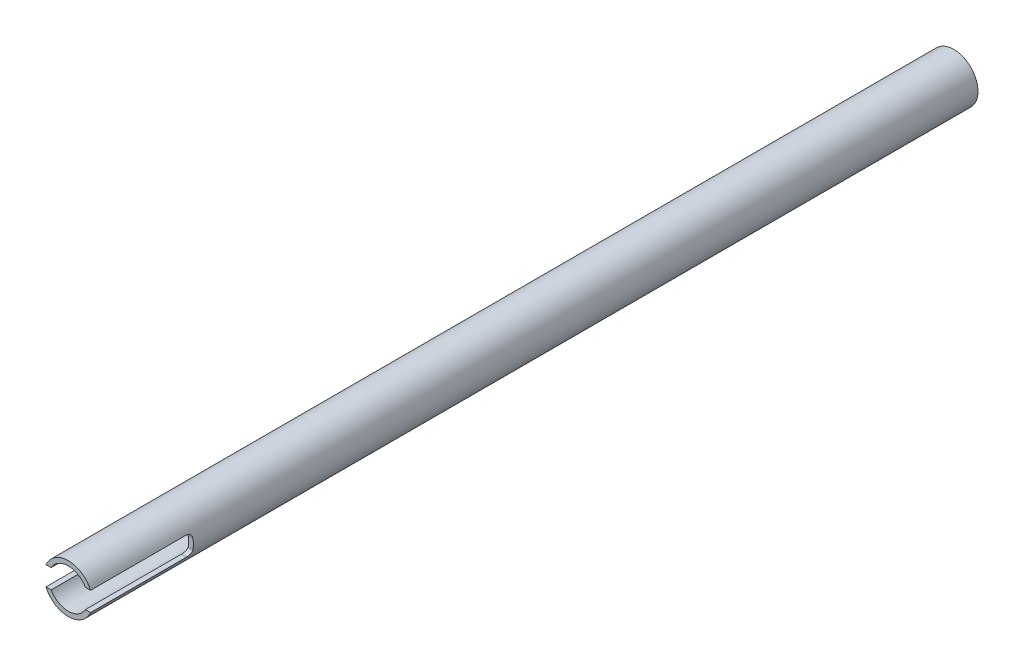
ISO-10303-21;
HEADER;
FILE_DESCRIPTION(('STEP AP214'),'2;1');
FILE_NAME('part.step','',(''),(''),'','','');
FILE_SCHEMA(('AUTOMOTIVE_DESIGN { 1 0 10303 214 1 1 1 1 }'));
ENDSEC;
DATA;
#1=APPLICATION_CONTEXT('core data for automotive mechanical design processes');
#2=APPLICATION_PROTOCOL_DEFINITION('international standard','automotive_design',2000,#1);
#3=PRODUCT_CONTEXT('',#1,'mechanical');
#4=PRODUCT('Part','Part','',(#3));
#5=PRODUCT_RELATED_PRODUCT_CATEGORY('part','',(#4));
#6=PRODUCT_DEFINITION_FORMATION('','',#4);
#7=PRODUCT_DEFINITION_CONTEXT('part definition',#1,'design');
#8=PRODUCT_DEFINITION('design','',#6,#7);
#9=PRODUCT_DEFINITION_SHAPE('','',#8);
#10=(LENGTH_UNIT() NAMED_UNIT(*) SI_UNIT(.MILLI.,.METRE.));
#11=(NAMED_UNIT(*) PLANE_ANGLE_UNIT() SI_UNIT($,.RADIAN.));
#12=(NAMED_UNIT(*) SI_UNIT($,.STERADIAN.) SOLID_ANGLE_UNIT());
#13=UNCERTAINTY_MEASURE_WITH_UNIT(LENGTH_MEASURE(1.E-05),#10,'distance_accuracy_value','');
#14=(GEOMETRIC_REPRESENTATION_CONTEXT(3) GLOBAL_UNCERTAINTY_ASSIGNED_CONTEXT((#13)) GLOBAL_UNIT_ASSIGNED_CONTEXT((#10,
#11,#12)) REPRESENTATION_CONTEXT('',''));
#15=CARTESIAN_POINT('',(0.,0.,0.));
#16=DIRECTION('',(0.,0.,1.));
#17=DIRECTION('',(1.,0.,0.));
#18=AXIS2_PLACEMENT_3D('',#15,#16,#17);
#19=CARTESIAN_POINT('',(0.,0.,0.));
#20=DIRECTION('',(0.,0.,-1.));
#21=DIRECTION('',(1.,0.,0.));
#22=AXIS2_PLACEMENT_3D('',#19,#20,#21);
#23=PLANE('',#22);
#24=DIRECTION('',(-1.,0.,0.));
#25=VECTOR('',#24,1.);
#26=CARTESIAN_POINT('',(376.220399741654,-3.17500000000001,0.));
#27=LINE('',#26,#25);
#28=CARTESIAN_POINT('',(7.34407080575888,-3.17500000000001,0.));
#29=VERTEX_POINT('',#28);
#30=CARTESIAN_POINT('',(5.64543213580679,-3.17499999999999,0.));
#31=VERTEX_POINT('',#30);
#32=EDGE_CURVE('E148',#29,#31,#27,.T.);
#33=ORIENTED_EDGE('',*,*,#32,.T.);
#34=CARTESIAN_POINT('',(0.,0.,0.));
#35=DIRECTION('',(0.,0.,1.));
#36=DIRECTION('',(1.,0.,0.));
#37=AXIS2_PLACEMENT_3D('',#34,#35,#36);
#38=CIRCLE('',#37,6.477);
#39=CARTESIAN_POINT('',(-5.64543213580682,-3.17500000000001,0.));
#40=VERTEX_POINT('',#39);
#41=EDGE_CURVE('E253',#40,#31,#38,.T.);
#42=ORIENTED_EDGE('',*,*,#41,.F.);
#43=CARTESIAN_POINT('',(-7.34407080575888,-3.17500000000001,0.));
#44=VERTEX_POINT('',#43);
#45=EDGE_CURVE('E143',#40,#44,#27,.T.);
#46=ORIENTED_EDGE('',*,*,#45,.T.);
#47=CARTESIAN_POINT('',(0.,0.,0.));
#48=DIRECTION('',(0.,0.,1.));
#49=DIRECTION('',(1.,0.,0.));
#50=AXIS2_PLACEMENT_3D('',#47,#48,#49);
#51=CIRCLE('',#50,8.001);
#52=EDGE_CURVE('E257',#44,#29,#51,.T.);
#53=ORIENTED_EDGE('',*,*,#52,.T.);
#54=EDGE_LOOP('',(#33,#42,#46,#53));
#55=FACE_BOUND('',#54,.T.);
#56=ADVANCED_FACE('F43',(#55),#23,.F.);
#57=CARTESIAN_POINT('',(0.,0.,-292.1));
#58=DIRECTION('',(0.,0.,1.));
#59=DIRECTION('',(-1.,0.,0.));
#60=AXIS2_PLACEMENT_3D('',#57,#58,#59);
#61=CYLINDRICAL_SURFACE('',#60,8.001);
#62=CARTESIAN_POINT('',(0.,0.,-292.1));
#63=DIRECTION('',(0.,0.,1.));
#64=DIRECTION('',(1.,0.,0.));
#65=AXIS2_PLACEMENT_3D('',#62,#63,#64);
#66=CIRCLE('',#65,8.001);
#67=CARTESIAN_POINT('',(8.001,0.,-292.1));
#68=VERTEX_POINT('',#67);
#69=EDGE_CURVE('E261',#68,#68,#66,.T.);
#70=ORIENTED_EDGE('',*,*,#69,.T.);
#71=EDGE_LOOP('',(#70));
#72=FACE_BOUND('',#71,.T.);
#73=DIRECTION('',(0.,0.,1.));
#74=VECTOR('',#73,1.);
#75=CARTESIAN_POINT('',(7.34407080575892,3.17499999999991,-292.1));
#76=LINE('',#75,#74);
#77=CARTESIAN_POINT('',(7.34407080575894,3.175,0.));
#78=VERTEX_POINT('',#77);
#79=CARTESIAN_POINT('',(7.34407080575889,3.17499999999999,-31.75));
#80=VERTEX_POINT('',#79);
#81=EDGE_CURVE('E248',#78,#80,#76,.F.);
#82=ORIENTED_EDGE('',*,*,#81,.T.);
#83=CARTESIAN_POINT('',(7.34407080575889,3.17499999999999,-31.75));
#84=CARTESIAN_POINT('',(7.34406800969131,3.17500157818637,-31.7906984476088));
#85=CARTESIAN_POINT('',(7.34477630214678,3.17336860893185,-31.8313759502433));
#86=CARTESIAN_POINT('',(7.34758309143993,3.16686635956911,-31.912411407968));
#87=CARTESIAN_POINT('',(7.34968118035478,3.16199802907894,-31.9527694533067));
#88=CARTESIAN_POINT('',(7.35798857580184,3.14264423927031,-32.0726338560667));
#89=CARTESIAN_POINT('',(7.36621159330719,3.12340930879255,-32.1512906881812));
#90=CARTESIAN_POINT('',(7.38735918413183,3.07305366060582,-32.3038993996992));
#91=CARTESIAN_POINT('',(7.40028060607282,3.04194090905527,-32.377854393813));
#92=CARTESIAN_POINT('',(7.42988157799941,2.96890708335136,-32.5194453435949));
#93=CARTESIAN_POINT('',(7.44656372650465,2.92697853298671,-32.5870768840646));
#94=CARTESIAN_POINT('',(7.48338951433549,2.83153727514406,-32.7173193992745));
#95=CARTESIAN_POINT('',(7.50365176960141,2.77760154335604,-32.7795861247467));
#96=CARTESIAN_POINT('',(7.54586923311685,2.66077336101832,-32.8943978381578));
#97=CARTESIAN_POINT('',(7.56782510086072,2.59787741319579,-32.9469390116058));
#98=CARTESIAN_POINT('',(7.61377353576087,2.4600953298757,-33.04442490565));
#99=CARTESIAN_POINT('',(7.6378032762924,2.38468542927394,-33.088613263246));
#100=CARTESIAN_POINT('',(7.68517828309944,2.22728162943211,-33.1635295949975));
#101=CARTESIAN_POINT('',(7.70852388215323,2.14529100625112,-33.1942642181981));
#102=CARTESIAN_POINT('',(7.74866065435345,1.99473307846586,-33.2363269168587));
#103=CARTESIAN_POINT('',(7.76579152458538,1.92700882203658,-33.2503889784846));
#104=CARTESIAN_POINT('',(7.79853598216448,1.78994063052701,-33.2692336722557));
#105=CARTESIAN_POINT('',(7.81414985826825,1.72059700681908,-33.2740180736839));
#106=CARTESIAN_POINT('',(7.8288057837706,1.65099999999999,-33.274));
#107=B_SPLINE_CURVE_WITH_KNOTS('',3,(#83,#84,#85,#86,#87,#88,#89,#90,#91,#92,#93,#94,#95,#96,
#97,#98,#99,#100,#101,#102,#103,#104,#105,#106),.UNSPECIFIED.,.F.,.F.,(4,2,2,2,2,2,2,2,2,2,2,4),
(0.,0.122015614312961,0.243995431359561,0.486888996424005,0.729619944201783,0.972519126749114,
1.22593711832599,1.47945429417213,1.75015649231414,2.02072475374975,2.23388433321155,
2.44700325838137),.UNSPECIFIED.);
#108=CARTESIAN_POINT('',(7.8288057837706,1.65099999999999,-33.274));
#109=VERTEX_POINT('',#108);
#110=EDGE_CURVE('E242',#80,#109,#107,.T.);
#111=ORIENTED_EDGE('',*,*,#110,.T.);
#112=CARTESIAN_POINT('',(0.,0.,-33.274));
#113=DIRECTION('',(0.,0.,-1.));
#114=DIRECTION('',(-1.,0.,0.));
#115=AXIS2_PLACEMENT_3D('',#112,#113,#114);
#116=CIRCLE('',#115,8.001);
#117=CARTESIAN_POINT('',(7.8288057837706,-1.65100000000001,-33.274));
#118=VERTEX_POINT('',#117);
#119=EDGE_CURVE('E158',#109,#118,#116,.T.);
#120=ORIENTED_EDGE('',*,*,#119,.T.);
#121=CARTESIAN_POINT('',(7.8288057837706,-1.65100000000001,-33.274));
#122=CARTESIAN_POINT('',(7.81947795268344,-1.69524181564516,-33.2739996807889));
#123=CARTESIAN_POINT('',(7.80977555287386,-1.73937906238705,-33.2720725755956));
#124=CARTESIAN_POINT('',(7.78970531909619,-1.82715995012295,-33.2644259194222));
#125=CARTESIAN_POINT('',(7.77933765259943,-1.87080371211602,-33.2587073195399));
#126=CARTESIAN_POINT('',(7.74740781787862,-2.00038689143381,-33.2359920832168));
#127=CARTESIAN_POINT('',(7.72497172734662,-2.08520038066886,-33.2134353611242));
#128=CARTESIAN_POINT('',(7.67879255624773,-2.24931803273245,-33.1543529357356));
#129=CARTESIAN_POINT('',(7.65505009243317,-2.3286247560322,-33.117833776622));
#130=CARTESIAN_POINT('',(7.60739952527334,-2.47987144136616,-33.0318403935313));
#131=CARTESIAN_POINT('',(7.58349136309819,-2.55180862700728,-32.9823613118312));
#132=CARTESIAN_POINT('',(7.5364011382251,-2.6877387711248,-32.8705553900397));
#133=CARTESIAN_POINT('',(7.51324222932275,-2.75155008701078,-32.8079974672164));
#134=CARTESIAN_POINT('',(7.46969556535497,-2.86766507697726,-32.6721080561482));
#135=CARTESIAN_POINT('',(7.44930787514765,-2.9199684817423,-32.5987763158346));
#136=CARTESIAN_POINT('',(7.41339882631974,-3.00995182097471,-32.445356056821));
#137=CARTESIAN_POINT('',(7.39775949227145,-3.04799299625045,-32.365507568052));
#138=CARTESIAN_POINT('',(7.37198636942665,-3.10981595853762,-32.1996963126839));
#139=CARTESIAN_POINT('',(7.36184321814923,-3.13362200161647,-32.1137442276388));
#140=CARTESIAN_POINT('',(7.35134082404797,-3.15814271182935,-31.980748149592));
#141=CARTESIAN_POINT('',(7.34862226710173,-3.16445643648464,-31.9348527548858));
#142=CARTESIAN_POINT('',(7.34498545577233,-3.17288497032067,-31.8426477775769));
#143=CARTESIAN_POINT('',(7.34406565426135,-3.17500338794751,-31.7963385853611));
#144=CARTESIAN_POINT('',(7.34407080575888,-3.175,-31.75));
#145=B_SPLINE_CURVE_WITH_KNOTS('',3,(#121,#122,#123,#124,#125,#126,#127,#128,#129,#130,#131,
#132,#133,#134,#135,#136,#137,#138,#139,#140,#141,#142,#143,#144),.UNSPECIFIED.,.F.,.F.,(4,2,2,
2,2,2,2,2,2,2,2,4),(0.,0.135553024626244,0.271072058592371,0.541437670457961,0.811676717226673,
1.082017202076,1.35761362878683,1.63321650449497,1.90127196271358,2.16886935439238,
2.3078905012207,2.4467920218655),.UNSPECIFIED.);
#146=CARTESIAN_POINT('',(7.34407080575888,-3.175,-31.75));
#147=VERTEX_POINT('',#146);
#148=EDGE_CURVE('E139',#118,#147,#145,.T.);
#149=ORIENTED_EDGE('',*,*,#148,.T.);
#150=DIRECTION('',(0.,0.,1.));
#151=VECTOR('',#150,1.);
#152=CARTESIAN_POINT('',(7.34407080575889,-3.17499999999999,-292.1));
#153=LINE('',#152,#151);
#154=EDGE_CURVE('E145',#147,#29,#153,.T.);
#155=ORIENTED_EDGE('',*,*,#154,.T.);
#156=ORIENTED_EDGE('',*,*,#52,.F.);
#157=DIRECTION('',(0.,0.,1.));
#158=VECTOR('',#157,1.);
#159=CARTESIAN_POINT('',(-7.34407080575889,-3.17499999999999,-292.1));
#160=LINE('',#159,#158);
#161=CARTESIAN_POINT('',(-7.34407080575888,-3.175,-31.75));
#162=VERTEX_POINT('',#161);
#163=EDGE_CURVE('E153',#44,#162,#160,.F.);
#164=ORIENTED_EDGE('',*,*,#163,.T.);
#165=CARTESIAN_POINT('',(-7.34407080575888,-3.175,-31.75));
#166=CARTESIAN_POINT('',(-7.3440680096913,-3.17500157818638,-31.7906984476088));
#167=CARTESIAN_POINT('',(-7.34477630214677,-3.17336860893187,-31.8313759502433));
#168=CARTESIAN_POINT('',(-7.34758309143993,-3.16686635956913,-31.912411407968));
#169=CARTESIAN_POINT('',(-7.34968118035477,-3.16199802907896,-31.9527694533067));
#170=CARTESIAN_POINT('',(-7.35798857580184,-3.14264423927033,-32.0726338560667));
#171=CARTESIAN_POINT('',(-7.36621159330718,-3.12340930879257,-32.1512906881812));
#172=CARTESIAN_POINT('',(-7.38735918413182,-3.07305366060584,-32.3038993996992));
#173=CARTESIAN_POINT('',(-7.40028060607282,-3.04194090905529,-32.377854393813));
#174=CARTESIAN_POINT('',(-7.4298815779994,-2.96890708335138,-32.5194453435949));
#175=CARTESIAN_POINT('',(-7.44656372650464,-2.92697853298673,-32.5870768840646));
#176=CARTESIAN_POINT('',(-7.48338951433548,-2.83153727514408,-32.7173193992745));
#177=CARTESIAN_POINT('',(-7.5036517696014,-2.77760154335605,-32.7795861247467));
#178=CARTESIAN_POINT('',(-7.54586923311684,-2.66077336101833,-32.8943978381578));
#179=CARTESIAN_POINT('',(-7.56782510086072,-2.59787741319581,-32.9469390116058));
#180=CARTESIAN_POINT('',(-7.61377353576087,-2.46009532987571,-33.04442490565));
#181=CARTESIAN_POINT('',(-7.63780327629239,-2.38468542927396,-33.088613263246));
#182=CARTESIAN_POINT('',(-7.68517828309943,-2.22728162943213,-33.1635295949975));
#183=CARTESIAN_POINT('',(-7.70852388215322,-2.14529100625114,-33.1942642181981));
#184=CARTESIAN_POINT('',(-7.74866065435345,-1.99473307846589,-33.2363269168587));
#185=CARTESIAN_POINT('',(-7.76579152458538,-1.9270088220366,-33.2503889784846));
#186=CARTESIAN_POINT('',(-7.79853598216448,-1.78994063052703,-33.2692336722557));
#187=CARTESIAN_POINT('',(-7.81414985826825,-1.7205970068191,-33.2740180736839));
#188=CARTESIAN_POINT('',(-7.8288057837706,-1.65100000000001,-33.274));
#189=B_SPLINE_CURVE_WITH_KNOTS('',3,(#165,#166,#167,#168,#169,#170,#171,#172,#173,#174,#175,
#176,#177,#178,#179,#180,#181,#182,#183,#184,#185,#186,#187,#188),.UNSPECIFIED.,.F.,.F.,(4,2,2,
2,2,2,2,2,2,2,2,4),(0.,0.122015614312961,0.243995431359561,0.486888996424005,0.729619944201783,
0.972519126749106,1.22593711832599,1.47945429417213,1.75015649231413,2.02072475374974,
2.23388433321154,2.44700325838136),.UNSPECIFIED.);
#190=CARTESIAN_POINT('',(-7.8288057837706,-1.65100000000001,-33.274));
#191=VERTEX_POINT('',#190);
#192=EDGE_CURVE('E152',#162,#191,#189,.T.);
#193=ORIENTED_EDGE('',*,*,#192,.T.);
#194=CARTESIAN_POINT('',(-7.8288057837706,1.65099999999999,-33.274));
#195=VERTEX_POINT('',#194);
#196=EDGE_CURVE('E159',#191,#195,#116,.T.);
#197=ORIENTED_EDGE('',*,*,#196,.T.);
#198=CARTESIAN_POINT('',(-7.8288057837706,1.65099999999999,-33.274));
#199=CARTESIAN_POINT('',(-7.81947795268345,1.69524181564514,-33.2739996807889));
#200=CARTESIAN_POINT('',(-7.80977555287386,1.73937906238703,-33.2720725755956));
#201=CARTESIAN_POINT('',(-7.7897053190962,1.82715995012294,-33.2644259194222));
#202=CARTESIAN_POINT('',(-7.77933765259943,1.870803712116,-33.2587073195399));
#203=CARTESIAN_POINT('',(-7.74740781787862,2.00038689143379,-33.2359920832168));
#204=CARTESIAN_POINT('',(-7.72497172734663,2.08520038066885,-33.2134353611242));
#205=CARTESIAN_POINT('',(-7.67879255624773,2.24931803273243,-33.1543529357356));
#206=CARTESIAN_POINT('',(-7.65505009243317,2.32862475603218,-33.117833776622));
#207=CARTESIAN_POINT('',(-7.60739952527334,2.47987144136614,-33.0318403935313));
#208=CARTESIAN_POINT('',(-7.58349136309819,2.55180862700726,-32.9823613118312));
#209=CARTESIAN_POINT('',(-7.53640113822511,2.68773877112478,-32.8705553900397));
#210=CARTESIAN_POINT('',(-7.51324222932276,2.75155008701076,-32.8079974672164));
#211=CARTESIAN_POINT('',(-7.46969556535498,2.86766507697724,-32.6721080561482));
#212=CARTESIAN_POINT('',(-7.44930787514765,2.91996848174228,-32.5987763158346));
#213=CARTESIAN_POINT('',(-7.41339882631975,3.00995182097469,-32.445356056821));
#214=CARTESIAN_POINT('',(-7.39775949227146,3.04799299625043,-32.365507568052));
#215=CARTESIAN_POINT('',(-7.37198636942666,3.10981595853761,-32.1996963126839));
#216=CARTESIAN_POINT('',(-7.36184321814924,3.13362200161646,-32.1137442276388));
#217=CARTESIAN_POINT('',(-7.35134082404798,3.15814271182933,-31.980748149592));
#218=CARTESIAN_POINT('',(-7.34862226710174,3.16445643648463,-31.9348527548858));
#219=CARTESIAN_POINT('',(-7.34498545577234,3.17288497032065,-31.8426477775769));
#220=CARTESIAN_POINT('',(-7.34406565426136,3.17500338794749,-31.7963385853611));
#221=CARTESIAN_POINT('',(-7.34407080575889,3.17499999999999,-31.75));
#222=B_SPLINE_CURVE_WITH_KNOTS('',3,(#198,#199,#200,#201,#202,#203,#204,#205,#206,#207,#208,
#209,#210,#211,#212,#213,#214,#215,#216,#217,#218,#219,#220,#221),.UNSPECIFIED.,.F.,.F.,(4,2,2,
2,2,2,2,2,2,2,2,4),(0.,0.135553024626245,0.271072058592375,0.541437670457962,0.811676717226676,
1.08201720207601,1.35761362878683,1.63321650449497,1.90127196271359,2.16886935439238,
2.3078905012207,2.44679202186551),.UNSPECIFIED.);
#223=CARTESIAN_POINT('',(-7.34407080575889,3.17499999999999,-31.75));
#224=VERTEX_POINT('',#223);
#225=EDGE_CURVE('E236',#195,#224,#222,.T.);
#226=ORIENTED_EDGE('',*,*,#225,.T.);
#227=DIRECTION('',(0.,0.,1.));
#228=VECTOR('',#227,1.);
#229=CARTESIAN_POINT('',(-7.34407080575892,3.17499999999991,-292.1));
#230=LINE('',#229,#228);
#231=CARTESIAN_POINT('',(-7.34407080575894,3.175,0.));
#232=VERTEX_POINT('',#231);
#233=EDGE_CURVE('E250',#224,#232,#230,.T.);
#234=ORIENTED_EDGE('',*,*,#233,.T.);
#235=EDGE_CURVE('E265',#78,#232,#51,.T.);
#236=ORIENTED_EDGE('',*,*,#235,.F.);
#237=EDGE_LOOP('',(#82,#111,#120,#149,#155,#156,#164,#193,#197,#226,#234,#236));
#238=FACE_BOUND('',#237,.T.);
#239=ADVANCED_FACE('F45',(#72,#238),#61,.T.);
#240=CARTESIAN_POINT('',(0.,0.,-292.1));
#241=DIRECTION('',(0.,0.,1.));
#242=DIRECTION('',(-1.,0.,0.));
#243=AXIS2_PLACEMENT_3D('',#240,#241,#242);
#244=CYLINDRICAL_SURFACE('',#243,6.477);
#245=CARTESIAN_POINT('',(0.,0.,-292.1));
#246=DIRECTION('',(0.,0.,1.));
#247=DIRECTION('',(1.,0.,0.));
#248=AXIS2_PLACEMENT_3D('',#245,#246,#247);
#249=CIRCLE('',#248,6.477);
#250=CARTESIAN_POINT('',(6.477,0.,-292.1));
#251=VERTEX_POINT('',#250);
#252=EDGE_CURVE('E254',#251,#251,#249,.T.);
#253=ORIENTED_EDGE('',*,*,#252,.F.);
#254=EDGE_LOOP('',(#253));
#255=FACE_BOUND('',#254,.T.);
#256=CARTESIAN_POINT('',(5.64543213580682,3.175,0.));
#257=VERTEX_POINT('',#256);
#258=CARTESIAN_POINT('',(-5.64543213580682,3.175,0.));
#259=VERTEX_POINT('',#258);
#260=EDGE_CURVE('E258',#257,#259,#38,.T.);
#261=ORIENTED_EDGE('',*,*,#260,.T.);
#262=DIRECTION('',(0.,0.,1.));
#263=VECTOR('',#262,1.);
#264=CARTESIAN_POINT('',(-5.64543213580684,3.17499999999991,-292.1));
#265=LINE('',#264,#263);
#266=CARTESIAN_POINT('',(-5.64543213580679,3.17499999999999,-31.75));
#267=VERTEX_POINT('',#266);
#268=EDGE_CURVE('E224',#267,#259,#265,.T.);
#269=ORIENTED_EDGE('',*,*,#268,.F.);
#270=CARTESIAN_POINT('',(-6.26304462701648,1.65099999999999,-33.274));
#271=CARTESIAN_POINT('',(-6.25119301356599,1.6959701904545,-33.2739996512926));
#272=CARTESIAN_POINT('',(-6.23885805015264,1.74078424361482,-33.2720087653986));
#273=CARTESIAN_POINT('',(-6.21333080831813,1.82980515275704,-33.264134138941));
#274=CARTESIAN_POINT('',(-6.20013884930389,1.87401222760583,-33.2582518413062));
#275=CARTESIAN_POINT('',(-6.15951133396887,2.00506101361782,-33.2349457970163));
#276=CARTESIAN_POINT('',(-6.1309497917237,2.09061085165533,-33.2118617467996));
#277=CARTESIAN_POINT('',(-6.07212151471614,2.25578612168242,-33.1516219603263));
#278=CARTESIAN_POINT('',(-6.04185654214358,2.3354174853139,-33.1144805465843));
#279=CARTESIAN_POINT('',(-5.98100165398783,2.48713337520252,-33.0271532445204));
#280=CARTESIAN_POINT('',(-5.95041151302897,2.5592122323776,-32.9769576544588));
#281=CARTESIAN_POINT('',(-5.8895977037007,2.69629003214927,-32.8627307014112));
#282=CARTESIAN_POINT('',(-5.85942026108733,2.76097278644594,-32.7982938275107));
#283=CARTESIAN_POINT('',(-5.80262181829035,2.87843237174361,-32.6579375307773));
#284=CARTESIAN_POINT('',(-5.77600068690933,2.93120964200443,-32.5820185317567));
#285=CARTESIAN_POINT('',(-5.72961508062246,3.02084256755069,-32.4238173863488));
#286=CARTESIAN_POINT('',(-5.70961192114586,3.0582680284345,-32.3419300118511));
#287=CARTESIAN_POINT('',(-5.67705818777087,3.11828924116527,-32.1715909438744));
#288=CARTESIAN_POINT('',(-5.66448853762437,3.14092296814994,-32.0831567140417));
#289=CARTESIAN_POINT('',(-5.65274801817816,3.1619637560802,-31.953042864781));
#290=CARTESIAN_POINT('',(-5.65001234622037,3.16684526064361,-31.9126313476031));
#291=CARTESIAN_POINT('',(-5.64635324825544,3.17336296637712,-31.8314890576694));
#292=CARTESIAN_POINT('',(-5.64542881846814,3.17500096508515,-31.790758474312));
#293=CARTESIAN_POINT('',(-5.6454321358068,3.17499999999999,-31.75));
#294=B_SPLINE_CURVE_WITH_KNOTS('',3,(#270,#271,#272,#273,#274,#275,#276,#277,#278,#279,#280,
#281,#282,#283,#284,#285,#286,#287,#288,#289,#290,#291,#292,#293),.UNSPECIFIED.,.F.,.F.,(4,2,2,
2,2,2,2,2,2,2,2,4),(0.,0.139419976741779,0.278788285754548,0.556665652257205,0.834260658887702,
1.11206256399923,1.39912695233711,1.68618074753331,1.9613229485987,2.23575596690122,
2.35800176569004,2.4801797973654),.UNSPECIFIED.);
#295=CARTESIAN_POINT('',(-6.26304462701648,1.65099999999999,-33.274));
#296=VERTEX_POINT('',#295);
#297=EDGE_CURVE('E218',#296,#267,#294,.T.);
#298=ORIENTED_EDGE('',*,*,#297,.F.);
#299=CARTESIAN_POINT('',(0.,0.,-33.274));
#300=DIRECTION('',(0.,0.,-1.));
#301=DIRECTION('',(-1.,0.,0.));
#302=AXIS2_PLACEMENT_3D('',#299,#300,#301);
#303=CIRCLE('',#302,6.477);
#304=CARTESIAN_POINT('',(-6.26304462701648,-1.65100000000001,-33.274));
#305=VERTEX_POINT('',#304);
#306=EDGE_CURVE('E225',#305,#296,#303,.T.);
#307=ORIENTED_EDGE('',*,*,#306,.F.);
#308=CARTESIAN_POINT('',(-5.64543213580679,-3.175,-31.75));
#309=CARTESIAN_POINT('',(-5.64542798532432,-3.17500253012492,-31.7895022750384));
#310=CARTESIAN_POINT('',(-5.64629676751122,-3.17346305780189,-31.8289831851797));
#311=CARTESIAN_POINT('',(-5.64973489172761,-3.16734010596935,-31.907616333837));
#312=CARTESIAN_POINT('',(-5.65230347216192,-3.16275798971435,-31.9467687115998));
#313=CARTESIAN_POINT('',(-5.6624528235623,-3.1445760828872,-32.0629070155873));
#314=CARTESIAN_POINT('',(-5.67247830845161,-3.12653965087182,-32.1390381879893));
#315=CARTESIAN_POINT('',(-5.69814957474154,-3.07950075965756,-32.2866255007952));
#316=CARTESIAN_POINT('',(-5.71378770060104,-3.05051323473279,-32.3580878532046));
#317=CARTESIAN_POINT('',(-5.74949312759985,-2.98267072120715,-32.4950337996201));
#318=CARTESIAN_POINT('',(-5.76956543427929,-2.94380457356397,-32.5605105176722));
#319=CARTESIAN_POINT('',(-5.81427344287327,-2.85454020484131,-32.6883725064171));
#320=CARTESIAN_POINT('',(-5.83912294015508,-2.80355001313475,-32.7502682413202));
#321=CARTESIAN_POINT('',(-5.89090094280742,-2.69305400468481,-32.8649190340714));
#322=CARTESIAN_POINT('',(-5.91783040535227,-2.63354425646506,-32.9176698468731));
#323=CARTESIAN_POINT('',(-5.97540269204169,-2.50037980782343,-33.0183991647787));
#324=CARTESIAN_POINT('',(-6.00613015030677,-2.42589024924428,-33.0652294493506));
#325=CARTESIAN_POINT('',(-6.0668505417897,-2.26977298542594,-33.1454912659983));
#326=CARTESIAN_POINT('',(-6.09684379767183,-2.18814849062355,-33.1789287868608));
#327=CARTESIAN_POINT('',(-6.1506895426371,-2.03135452128193,-33.2277262918858));
#328=CARTESIAN_POINT('',(-6.17481721444705,-1.9568565840907,-33.2449485076857));
#329=CARTESIAN_POINT('',(-6.22080900465629,-1.80539896583254,-33.2681012531514));
#330=CARTESIAN_POINT('',(-6.24267154884634,-1.72843762073708,-33.2740239790673));
#331=CARTESIAN_POINT('',(-6.26304462701648,-1.65100000000001,-33.274));
#332=B_SPLINE_CURVE_WITH_KNOTS('',3,(#308,#309,#310,#311,#312,#313,#314,#315,#316,#317,#318,
#319,#320,#321,#322,#323,#324,#325,#326,#327,#328,#329,#330,#331),.UNSPECIFIED.,.F.,.F.,(4,2,2,
2,2,2,2,2,2,2,2,4),(0.,0.118426117882546,0.236799210795261,0.472172634307245,0.707226225252078,
0.942546525606797,1.19340365391802,1.44437691938387,1.72272641785954,2.00095130860679,
2.24064521780669,2.48050460661625),.UNSPECIFIED.);
#333=CARTESIAN_POINT('',(-5.64543213580679,-3.17499999999999,-31.7500000000001));
#334=VERTEX_POINT('',#333);
#335=EDGE_CURVE('E185',#334,#305,#332,.T.);
#336=ORIENTED_EDGE('',*,*,#335,.F.);
#337=DIRECTION('',(0.,0.,1.));
#338=VECTOR('',#337,1.);
#339=CARTESIAN_POINT('',(-5.64543213580679,-3.17499999999999,-292.1));
#340=LINE('',#339,#338);
#341=EDGE_CURVE('E264',#40,#334,#340,.F.);
#342=ORIENTED_EDGE('',*,*,#341,.F.);
#343=ORIENTED_EDGE('',*,*,#41,.T.);
#344=DIRECTION('',(0.,0.,1.));
#345=VECTOR('',#344,1.);
#346=CARTESIAN_POINT('',(5.64543213580679,-3.17499999999999,-292.1));
#347=LINE('',#346,#345);
#348=CARTESIAN_POINT('',(5.64543213580682,-3.175,-31.75));
#349=VERTEX_POINT('',#348);
#350=EDGE_CURVE('E67',#349,#31,#347,.T.);
#351=ORIENTED_EDGE('',*,*,#350,.F.);
#352=CARTESIAN_POINT('',(6.26304462701648,-1.65100000000001,-33.274));
#353=CARTESIAN_POINT('',(6.25119301356599,-1.69597019045452,-33.2739996512926));
#354=CARTESIAN_POINT('',(6.23885805015263,-1.74078424361484,-33.2720087653986));
#355=CARTESIAN_POINT('',(6.21333080831812,-1.82980515275706,-33.264134138941));
#356=CARTESIAN_POINT('',(6.20013884930389,-1.87401222760585,-33.2582518413062));
#357=CARTESIAN_POINT('',(6.15951133396886,-2.00506101361784,-33.2349457970163));
#358=CARTESIAN_POINT('',(6.13094979172369,-2.09061085165535,-33.2118617467996));
#359=CARTESIAN_POINT('',(6.07212151471613,-2.25578612168244,-33.1516219603263));
#360=CARTESIAN_POINT('',(6.04185654214358,-2.33541748531392,-33.1144805465843));
#361=CARTESIAN_POINT('',(5.98100165398782,-2.48713337520254,-33.0271532445204));
#362=CARTESIAN_POINT('',(5.95041151302896,-2.55921223237762,-32.9769576544588));
#363=CARTESIAN_POINT('',(5.88959770370069,-2.69629003214929,-32.8627307014112));
#364=CARTESIAN_POINT('',(5.85942026108732,-2.76097278644595,-32.7982938275107));
#365=CARTESIAN_POINT('',(5.80262181829034,-2.87843237174363,-32.6579375307773));
#366=CARTESIAN_POINT('',(5.77600068690932,-2.93120964200445,-32.5820185317567));
#367=CARTESIAN_POINT('',(5.72961508062245,-3.02084256755071,-32.4238173863488));
#368=CARTESIAN_POINT('',(5.70961192114585,-3.05826802843451,-32.3419300118511));
#369=CARTESIAN_POINT('',(5.67705818777086,-3.11828924116529,-32.1715909438744));
#370=CARTESIAN_POINT('',(5.66448853762436,-3.14092296814996,-32.0831567140417));
#371=CARTESIAN_POINT('',(5.65274801817815,-3.16196375608022,-31.953042864781));
#372=CARTESIAN_POINT('',(5.65001234622036,-3.16684526064363,-31.9126313476031));
#373=CARTESIAN_POINT('',(5.64635324825543,-3.17336296637714,-31.8314890576694));
#374=CARTESIAN_POINT('',(5.64542881846813,-3.17500096508517,-31.790758474312));
#375=CARTESIAN_POINT('',(5.64543213580679,-3.175,-31.75));
#376=B_SPLINE_CURVE_WITH_KNOTS('',3,(#352,#353,#354,#355,#356,#357,#358,#359,#360,#361,#362,
#363,#364,#365,#366,#367,#368,#369,#370,#371,#372,#373,#374,#375),.UNSPECIFIED.,.F.,.F.,(4,2,2,
2,2,2,2,2,2,2,2,4),(0.,0.139419976741779,0.278788285754547,0.556665652257203,0.834260658887697,
1.11206256399923,1.3991269523371,1.6861807475333,1.9613229485987,2.23575596690122,
2.35800176569004,2.48017979736539),.UNSPECIFIED.);
#377=CARTESIAN_POINT('',(6.26304462701648,-1.65100000000001,-33.274));
#378=VERTEX_POINT('',#377);
#379=EDGE_CURVE('E142',#378,#349,#376,.T.);
#380=ORIENTED_EDGE('',*,*,#379,.F.);
#381=CARTESIAN_POINT('',(6.26304462701648,1.65099999999999,-33.274));
#382=VERTEX_POINT('',#381);
#383=EDGE_CURVE('E200',#382,#378,#303,.T.);
#384=ORIENTED_EDGE('',*,*,#383,.F.);
#385=CARTESIAN_POINT('',(5.6454321358068,3.17499999999999,-31.75));
#386=CARTESIAN_POINT('',(5.64542798532432,3.1750025301249,-31.7895022750384));
#387=CARTESIAN_POINT('',(5.64629676751123,3.17346305780188,-31.8289831851797));
#388=CARTESIAN_POINT('',(5.64973489172762,3.16734010596933,-31.907616333837));
#389=CARTESIAN_POINT('',(5.65230347216193,3.16275798971433,-31.9467687115998));
#390=CARTESIAN_POINT('',(5.66245282356231,3.14457608288718,-32.0629070155873));
#391=CARTESIAN_POINT('',(5.67247830845162,3.1265396508718,-32.1390381879893));
#392=CARTESIAN_POINT('',(5.69814957474155,3.07950075965754,-32.2866255007952));
#393=CARTESIAN_POINT('',(5.71378770060105,3.05051323473277,-32.3580878532046));
#394=CARTESIAN_POINT('',(5.74949312759986,2.98267072120713,-32.4950337996201));
#395=CARTESIAN_POINT('',(5.7695654342793,2.94380457356395,-32.5605105176722));
#396=CARTESIAN_POINT('',(5.81427344287328,2.85454020484128,-32.6883725064171));
#397=CARTESIAN_POINT('',(5.83912294015509,2.80355001313473,-32.7502682413202));
#398=CARTESIAN_POINT('',(5.89090094280743,2.69305400468479,-32.8649190340714));
#399=CARTESIAN_POINT('',(5.91783040535228,2.63354425646504,-32.9176698468731));
#400=CARTESIAN_POINT('',(5.9754026920417,2.50037980782341,-33.0183991647787));
#401=CARTESIAN_POINT('',(6.00613015030678,2.42589024924425,-33.0652294493506));
#402=CARTESIAN_POINT('',(6.06685054178971,2.26977298542591,-33.1454912659983));
#403=CARTESIAN_POINT('',(6.09684379767184,2.18814849062352,-33.1789287868608));
#404=CARTESIAN_POINT('',(6.15068954263711,2.0313545212819,-33.2277262918858));
#405=CARTESIAN_POINT('',(6.17481721444706,1.95685658409067,-33.2449485076857));
#406=CARTESIAN_POINT('',(6.2208090046563,1.80539896583251,-33.2681012531514));
#407=CARTESIAN_POINT('',(6.24267154884635,1.72843762073706,-33.2740239790673));
#408=CARTESIAN_POINT('',(6.26304462701648,1.65099999999999,-33.274));
#409=B_SPLINE_CURVE_WITH_KNOTS('',3,(#385,#386,#387,#388,#389,#390,#391,#392,#393,#394,#395,
#396,#397,#398,#399,#400,#401,#402,#403,#404,#405,#406,#407,#408),.UNSPECIFIED.,.F.,.F.,(4,2,2,
2,2,2,2,2,2,2,2,4),(0.,0.118426117882553,0.236799210795268,0.472172634307253,0.707226225252078,
0.942546525606806,1.19340365391803,1.44437691938388,1.72272641785956,2.0009513086068,
2.2406452178067,2.48050460661625),.UNSPECIFIED.);
#410=CARTESIAN_POINT('',(5.64543213580679,3.17499999999999,-31.75));
#411=VERTEX_POINT('',#410);
#412=EDGE_CURVE('E52',#411,#382,#409,.T.);
#413=ORIENTED_EDGE('',*,*,#412,.F.);
#414=DIRECTION('',(0.,0.,1.));
#415=VECTOR('',#414,1.);
#416=CARTESIAN_POINT('',(5.64543213580684,3.17499999999991,-292.1));
#417=LINE('',#416,#415);
#418=EDGE_CURVE('E11',#257,#411,#417,.F.);
#419=ORIENTED_EDGE('',*,*,#418,.F.);
#420=EDGE_LOOP('',(#261,#269,#298,#307,#336,#342,#343,#351,#380,#384,#413,#419));
#421=FACE_BOUND('',#420,.T.);
#422=ADVANCED_FACE('F206',(#255,#421),#244,.F.);
#423=CARTESIAN_POINT('',(0.,0.,-292.1));
#424=DIRECTION('',(0.,0.,-1.));
#425=DIRECTION('',(1.,0.,0.));
#426=AXIS2_PLACEMENT_3D('',#423,#424,#425);
#427=PLANE('',#426);
#428=ORIENTED_EDGE('',*,*,#69,.F.);
#429=EDGE_LOOP('',(#428));
#430=FACE_BOUND('',#429,.T.);
#431=ORIENTED_EDGE('',*,*,#252,.T.);
#432=EDGE_LOOP('',(#431));
#433=FACE_BOUND('',#432,.T.);
#434=ADVANCED_FACE('F211',(#430,#433),#427,.T.);
#435=ORIENTED_EDGE('',*,*,#235,.T.);
#436=DIRECTION('',(-1.,0.,0.));
#437=VECTOR('',#436,1.);
#438=CARTESIAN_POINT('',(376.220399741654,3.175,0.));
#439=LINE('',#438,#437);
#440=EDGE_CURVE('E289',#259,#232,#439,.T.);
#441=ORIENTED_EDGE('',*,*,#440,.F.);
#442=ORIENTED_EDGE('',*,*,#260,.F.);
#443=EDGE_CURVE('E294',#78,#257,#439,.T.);
#444=ORIENTED_EDGE('',*,*,#443,.F.);
#445=EDGE_LOOP('',(#435,#441,#442,#444));
#446=FACE_BOUND('',#445,.T.);
#447=ADVANCED_FACE('F293',(#446),#23,.F.);
#448=CARTESIAN_POINT('',(376.220399741654,-3.175,-31.75));
#449=DIRECTION('',(0.,1.,0.));
#450=DIRECTION('',(0.,0.,-1.));
#451=AXIS2_PLACEMENT_3D('',#448,#449,#450);
#452=PLANE('',#451);
#453=ORIENTED_EDGE('',*,*,#45,.F.);
#454=ORIENTED_EDGE('',*,*,#341,.T.);
#455=DIRECTION('',(-1.,0.,0.));
#456=VECTOR('',#455,1.);
#457=CARTESIAN_POINT('',(376.220399741654,-3.175,-31.75));
#458=LINE('',#457,#456);
#459=EDGE_CURVE('E59',#334,#162,#458,.T.);
#460=ORIENTED_EDGE('',*,*,#459,.T.);
#461=ORIENTED_EDGE('',*,*,#163,.F.);
#462=EDGE_LOOP('',(#453,#454,#460,#461));
#463=FACE_BOUND('',#462,.T.);
#464=ADVANCED_FACE('F302',(#463),#452,.T.);
#465=CARTESIAN_POINT('',(376.220399741654,-1.65100000000001,-31.75));
#466=DIRECTION('',(-1.,0.,0.));
#467=DIRECTION('',(0.,0.,-1.));
#468=AXIS2_PLACEMENT_3D('',#465,#466,#467);
#469=CYLINDRICAL_SURFACE('',#468,1.524);
#470=ORIENTED_EDGE('',*,*,#459,.F.);
#471=ORIENTED_EDGE('',*,*,#335,.T.);
#472=DIRECTION('',(-1.,0.,0.));
#473=VECTOR('',#472,1.);
#474=CARTESIAN_POINT('',(376.220399741654,-1.65100000000001,-33.274));
#475=LINE('',#474,#473);
#476=EDGE_CURVE('E303',#305,#191,#475,.T.);
#477=ORIENTED_EDGE('',*,*,#476,.T.);
#478=ORIENTED_EDGE('',*,*,#192,.F.);
#479=EDGE_LOOP('',(#470,#471,#477,#478));
#480=FACE_BOUND('',#479,.T.);
#481=ADVANCED_FACE('F180',(#480),#469,.F.);
#482=CARTESIAN_POINT('',(376.220399741654,1.65099999999999,-33.274));
#483=DIRECTION('',(0.,0.,1.));
#484=DIRECTION('',(-1.,0.,0.));
#485=AXIS2_PLACEMENT_3D('',#482,#483,#484);
#486=PLANE('',#485);
#487=ORIENTED_EDGE('',*,*,#476,.F.);
#488=ORIENTED_EDGE('',*,*,#306,.T.);
#489=DIRECTION('',(-1.,0.,0.));
#490=VECTOR('',#489,1.);
#491=CARTESIAN_POINT('',(376.220399741654,1.65099999999999,-33.274));
#492=LINE('',#491,#490);
#493=EDGE_CURVE('E308',#296,#195,#492,.T.);
#494=ORIENTED_EDGE('',*,*,#493,.T.);
#495=ORIENTED_EDGE('',*,*,#196,.F.);
#496=EDGE_LOOP('',(#487,#488,#494,#495));
#497=FACE_BOUND('',#496,.T.);
#498=ADVANCED_FACE('F307',(#497),#486,.T.);
#499=CARTESIAN_POINT('',(376.220399741654,1.65099999999999,-31.75));
#500=DIRECTION('',(-1.,0.,0.));
#501=DIRECTION('',(0.,0.,-1.));
#502=AXIS2_PLACEMENT_3D('',#499,#500,#501);
#503=CYLINDRICAL_SURFACE('',#502,1.524);
#504=ORIENTED_EDGE('',*,*,#493,.F.);
#505=ORIENTED_EDGE('',*,*,#297,.T.);
#506=DIRECTION('',(-1.,0.,0.));
#507=VECTOR('',#506,1.);
#508=CARTESIAN_POINT('',(376.220399741654,3.17499999999999,-31.75));
#509=LINE('',#508,#507);
#510=EDGE_CURVE('E290',#267,#224,#509,.T.);
#511=ORIENTED_EDGE('',*,*,#510,.T.);
#512=ORIENTED_EDGE('',*,*,#225,.F.);
#513=EDGE_LOOP('',(#504,#505,#511,#512));
#514=FACE_BOUND('',#513,.T.);
#515=ADVANCED_FACE('F231',(#514),#503,.F.);
#516=CARTESIAN_POINT('',(376.220399741654,3.175,0.));
#517=DIRECTION('',(0.,-1.,0.));
#518=DIRECTION('',(0.,0.,1.));
#519=AXIS2_PLACEMENT_3D('',#516,#517,#518);
#520=PLANE('',#519);
#521=ORIENTED_EDGE('',*,*,#510,.F.);
#522=ORIENTED_EDGE('',*,*,#268,.T.);
#523=ORIENTED_EDGE('',*,*,#440,.T.);
#524=ORIENTED_EDGE('',*,*,#233,.F.);
#525=EDGE_LOOP('',(#521,#522,#523,#524));
#526=FACE_BOUND('',#525,.T.);
#527=ADVANCED_FACE('F213',(#526),#520,.T.);
#528=ORIENTED_EDGE('',*,*,#443,.T.);
#529=ORIENTED_EDGE('',*,*,#418,.T.);
#530=EDGE_CURVE('E281',#80,#411,#509,.T.);
#531=ORIENTED_EDGE('',*,*,#530,.F.);
#532=ORIENTED_EDGE('',*,*,#81,.F.);
#533=EDGE_LOOP('',(#528,#529,#531,#532));
#534=FACE_BOUND('',#533,.T.);
#535=ADVANCED_FACE('F229',(#534),#520,.T.);
#536=ORIENTED_EDGE('',*,*,#530,.T.);
#537=ORIENTED_EDGE('',*,*,#412,.T.);
#538=EDGE_CURVE('E280',#109,#382,#492,.T.);
#539=ORIENTED_EDGE('',*,*,#538,.F.);
#540=ORIENTED_EDGE('',*,*,#110,.F.);
#541=EDGE_LOOP('',(#536,#537,#539,#540));
#542=FACE_BOUND('',#541,.T.);
#543=ADVANCED_FACE('F226',(#542),#503,.F.);
#544=ORIENTED_EDGE('',*,*,#538,.T.);
#545=ORIENTED_EDGE('',*,*,#383,.T.);
#546=EDGE_CURVE('E305',#118,#378,#475,.T.);
#547=ORIENTED_EDGE('',*,*,#546,.F.);
#548=ORIENTED_EDGE('',*,*,#119,.F.);
#549=EDGE_LOOP('',(#544,#545,#547,#548));
#550=FACE_BOUND('',#549,.T.);
#551=ADVANCED_FACE('F179',(#550),#486,.T.);
#552=ORIENTED_EDGE('',*,*,#546,.T.);
#553=ORIENTED_EDGE('',*,*,#379,.T.);
#554=EDGE_CURVE('E135',#147,#349,#458,.T.);
#555=ORIENTED_EDGE('',*,*,#554,.F.);
#556=ORIENTED_EDGE('',*,*,#148,.F.);
#557=EDGE_LOOP('',(#552,#553,#555,#556));
#558=FACE_BOUND('',#557,.T.);
#559=ADVANCED_FACE('F137',(#558),#469,.F.);
#560=ORIENTED_EDGE('',*,*,#554,.T.);
#561=ORIENTED_EDGE('',*,*,#350,.T.);
#562=ORIENTED_EDGE('',*,*,#32,.F.);
#563=ORIENTED_EDGE('',*,*,#154,.F.);
#564=EDGE_LOOP('',(#560,#561,#562,#563));
#565=FACE_BOUND('',#564,.T.);
#566=ADVANCED_FACE('F146',(#565),#452,.T.);
#567=CLOSED_SHELL('',(#56,#239,#422,#434,#447,#464,#481,#498,#515,#527,#535,#543,#551,#559,#566));
#568=MANIFOLD_SOLID_BREP('B2',#567);
#569=ADVANCED_BREP_SHAPE_REPRESENTATION('',(#18,#568),#14);
#570=SHAPE_DEFINITION_REPRESENTATION(#9,#569);
ENDSEC;
END-ISO-10303-21;
